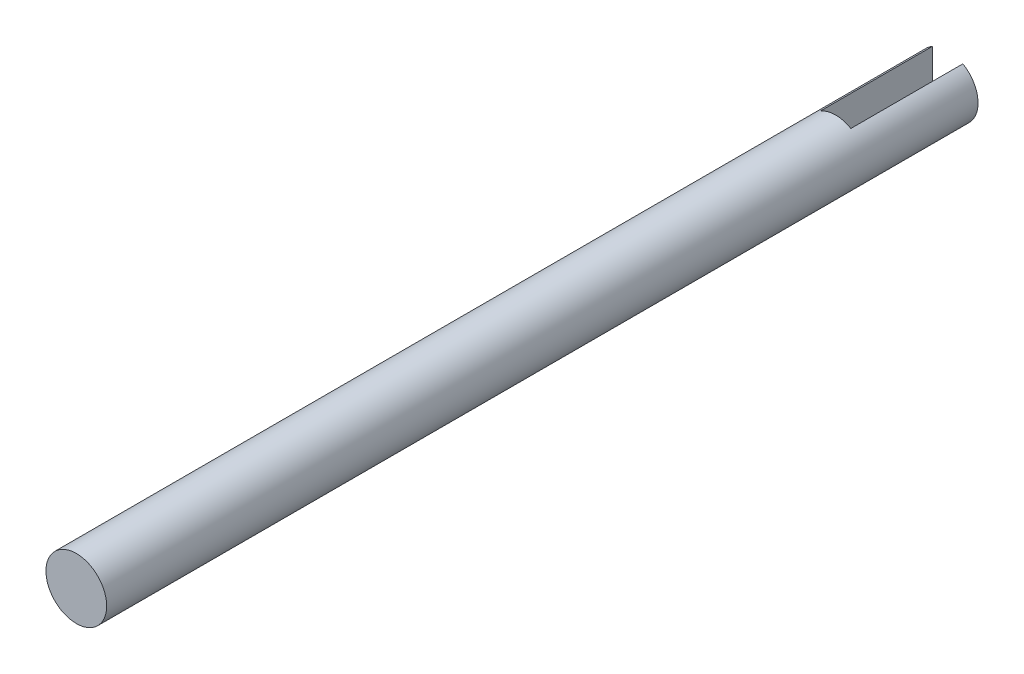
ISO-10303-21;
HEADER;
FILE_DESCRIPTION(('STEP AP214'),'2;1');
FILE_NAME('part.step','',(''),(''),'','','');
FILE_SCHEMA(('AUTOMOTIVE_DESIGN { 1 0 10303 214 1 1 1 1 }'));
ENDSEC;
DATA;
#1=APPLICATION_CONTEXT('core data for automotive mechanical design processes');
#2=APPLICATION_PROTOCOL_DEFINITION('international standard','automotive_design',2000,#1);
#3=PRODUCT_CONTEXT('',#1,'mechanical');
#4=PRODUCT('Part','Part','',(#3));
#5=PRODUCT_RELATED_PRODUCT_CATEGORY('part','',(#4));
#6=PRODUCT_DEFINITION_FORMATION('','',#4);
#7=PRODUCT_DEFINITION_CONTEXT('part definition',#1,'design');
#8=PRODUCT_DEFINITION('design','',#6,#7);
#9=PRODUCT_DEFINITION_SHAPE('','',#8);
#10=(LENGTH_UNIT() NAMED_UNIT(*) SI_UNIT(.MILLI.,.METRE.));
#11=(NAMED_UNIT(*) PLANE_ANGLE_UNIT() SI_UNIT($,.RADIAN.));
#12=(NAMED_UNIT(*) SI_UNIT($,.STERADIAN.) SOLID_ANGLE_UNIT());
#13=UNCERTAINTY_MEASURE_WITH_UNIT(LENGTH_MEASURE(1.E-05),#10,'distance_accuracy_value','');
#14=(GEOMETRIC_REPRESENTATION_CONTEXT(3) GLOBAL_UNCERTAINTY_ASSIGNED_CONTEXT((#13)) GLOBAL_UNIT_ASSIGNED_CONTEXT((#10,
#11,#12)) REPRESENTATION_CONTEXT('',''));
#15=CARTESIAN_POINT('',(0.,0.,0.));
#16=DIRECTION('',(0.,0.,1.));
#17=DIRECTION('',(1.,0.,0.));
#18=AXIS2_PLACEMENT_3D('',#15,#16,#17);
#19=CARTESIAN_POINT('',(0.,0.,107.5));
#20=DIRECTION('',(0.,0.,-1.));
#21=DIRECTION('',(-1.,0.,0.));
#22=AXIS2_PLACEMENT_3D('',#19,#20,#21);
#23=CYLINDRICAL_SURFACE('',#22,4.);
#24=CARTESIAN_POINT('',(0.,0.,107.5));
#25=DIRECTION('',(0.,0.,1.));
#26=DIRECTION('',(1.,0.,0.));
#27=AXIS2_PLACEMENT_3D('',#24,#25,#26);
#28=CIRCLE('',#27,4.);
#29=CARTESIAN_POINT('',(4.,0.,107.5));
#30=VERTEX_POINT('',#29);
#31=EDGE_CURVE('E11',#30,#30,#28,.T.);
#32=ORIENTED_EDGE('',*,*,#31,.F.);
#33=EDGE_LOOP('',(#32));
#34=FACE_BOUND('',#33,.T.);
#35=CARTESIAN_POINT('',(0.,0.,7.5));
#36=DIRECTION('',(0.,0.,1.));
#37=DIRECTION('',(1.,0.,0.));
#38=AXIS2_PLACEMENT_3D('',#35,#36,#37);
#39=CIRCLE('',#38,4.);
#40=CARTESIAN_POINT('',(2.,3.46410161513775,7.5));
#41=VERTEX_POINT('',#40);
#42=CARTESIAN_POINT('',(-2.,3.46410161513775,7.5));
#43=VERTEX_POINT('',#42);
#44=EDGE_CURVE('E46',#41,#43,#39,.T.);
#45=ORIENTED_EDGE('',*,*,#44,.T.);
#46=DIRECTION('',(0.,0.,1.));
#47=VECTOR('',#46,1.);
#48=CARTESIAN_POINT('',(-2.,3.46410161513775,-7.25));
#49=LINE('',#48,#47);
#50=CARTESIAN_POINT('',(-2.,3.46410161513775,-7.25));
#51=VERTEX_POINT('',#50);
#52=EDGE_CURVE('E57',#51,#43,#49,.T.);
#53=ORIENTED_EDGE('',*,*,#52,.F.);
#54=CARTESIAN_POINT('',(0.,0.,-7.25));
#55=DIRECTION('',(0.,0.,1.));
#56=DIRECTION('',(1.,0.,0.));
#57=AXIS2_PLACEMENT_3D('',#54,#55,#56);
#58=CIRCLE('',#57,4.);
#59=CARTESIAN_POINT('',(-2.,-3.46410161513775,-7.25));
#60=VERTEX_POINT('',#59);
#61=EDGE_CURVE('E85',#51,#60,#58,.T.);
#62=ORIENTED_EDGE('',*,*,#61,.T.);
#63=DIRECTION('',(0.,0.,1.));
#64=VECTOR('',#63,1.);
#65=CARTESIAN_POINT('',(-2.,-3.46410161513775,-7.25));
#66=LINE('',#65,#64);
#67=CARTESIAN_POINT('',(-2.,-3.46410161513775,7.5));
#68=VERTEX_POINT('',#67);
#69=EDGE_CURVE('E82',#60,#68,#66,.T.);
#70=ORIENTED_EDGE('',*,*,#69,.T.);
#71=CARTESIAN_POINT('',(2.,-3.46410161513775,7.5));
#72=VERTEX_POINT('',#71);
#73=EDGE_CURVE('E65',#68,#72,#39,.T.);
#74=ORIENTED_EDGE('',*,*,#73,.T.);
#75=DIRECTION('',(0.,0.,1.));
#76=VECTOR('',#75,1.);
#77=CARTESIAN_POINT('',(2.,-3.46410161513775,-7.25));
#78=LINE('',#77,#76);
#79=CARTESIAN_POINT('',(2.,-3.46410161513775,-7.25));
#80=VERTEX_POINT('',#79);
#81=EDGE_CURVE('E98',#80,#72,#78,.T.);
#82=ORIENTED_EDGE('',*,*,#81,.F.);
#83=CARTESIAN_POINT('',(0.,0.,-7.25));
#84=DIRECTION('',(0.,0.,1.));
#85=DIRECTION('',(1.,0.,0.));
#86=AXIS2_PLACEMENT_3D('',#83,#84,#85);
#87=CIRCLE('',#86,4.);
#88=CARTESIAN_POINT('',(2.,3.46410161513775,-7.25));
#89=VERTEX_POINT('',#88);
#90=EDGE_CURVE('E107',#80,#89,#87,.T.);
#91=ORIENTED_EDGE('',*,*,#90,.T.);
#92=DIRECTION('',(0.,0.,1.));
#93=VECTOR('',#92,1.);
#94=CARTESIAN_POINT('',(2.,3.46410161513775,-7.25));
#95=LINE('',#94,#93);
#96=EDGE_CURVE('E99',#89,#41,#95,.T.);
#97=ORIENTED_EDGE('',*,*,#96,.T.);
#98=EDGE_LOOP('',(#45,#53,#62,#70,#74,#82,#91,#97));
#99=FACE_BOUND('',#98,.T.);
#100=ADVANCED_FACE('F43',(#34,#99),#23,.T.);
#101=CARTESIAN_POINT('',(0.,0.,107.5));
#102=DIRECTION('',(0.,0.,1.));
#103=DIRECTION('',(1.,0.,0.));
#104=AXIS2_PLACEMENT_3D('',#101,#102,#103);
#105=PLANE('',#104);
#106=ORIENTED_EDGE('',*,*,#31,.T.);
#107=EDGE_LOOP('',(#106));
#108=FACE_BOUND('',#107,.T.);
#109=ADVANCED_FACE('F125',(#108),#105,.T.);
#110=CARTESIAN_POINT('',(0.,0.,7.5));
#111=DIRECTION('',(0.,0.,1.));
#112=DIRECTION('',(1.,0.,0.));
#113=AXIS2_PLACEMENT_3D('',#110,#111,#112);
#114=PLANE('',#113);
#115=ORIENTED_EDGE('',*,*,#73,.F.);
#116=DIRECTION('',(0.,1.,0.));
#117=VECTOR('',#116,1.);
#118=CARTESIAN_POINT('',(-2.,-3.46410161513775,7.5));
#119=LINE('',#118,#117);
#120=EDGE_CURVE('E89',#68,#43,#119,.T.);
#121=ORIENTED_EDGE('',*,*,#120,.T.);
#122=ORIENTED_EDGE('',*,*,#44,.F.);
#123=DIRECTION('',(0.,-1.,0.));
#124=VECTOR('',#123,1.);
#125=CARTESIAN_POINT('',(2.,3.46410161513775,7.5));
#126=LINE('',#125,#124);
#127=EDGE_CURVE('E93',#41,#72,#126,.T.);
#128=ORIENTED_EDGE('',*,*,#127,.T.);
#129=EDGE_LOOP('',(#115,#121,#122,#128));
#130=FACE_BOUND('',#129,.T.);
#131=ADVANCED_FACE('F96',(#130),#114,.F.);
#132=CARTESIAN_POINT('',(2.,3.46410161513775,-7.25));
#133=DIRECTION('',(-1.,0.,0.));
#134=DIRECTION('',(0.,0.,1.));
#135=AXIS2_PLACEMENT_3D('',#132,#133,#134);
#136=PLANE('',#135);
#137=ORIENTED_EDGE('',*,*,#127,.F.);
#138=ORIENTED_EDGE('',*,*,#96,.F.);
#139=DIRECTION('',(0.,-1.,0.));
#140=VECTOR('',#139,1.);
#141=CARTESIAN_POINT('',(2.,3.46410161513775,-7.25));
#142=LINE('',#141,#140);
#143=EDGE_CURVE('E103',#89,#80,#142,.T.);
#144=ORIENTED_EDGE('',*,*,#143,.T.);
#145=ORIENTED_EDGE('',*,*,#81,.T.);
#146=EDGE_LOOP('',(#137,#138,#144,#145));
#147=FACE_BOUND('',#146,.T.);
#148=ADVANCED_FACE('F138',(#147),#136,.T.);
#149=CARTESIAN_POINT('',(0.,0.,-7.25));
#150=DIRECTION('',(0.,0.,1.));
#151=DIRECTION('',(1.,0.,0.));
#152=AXIS2_PLACEMENT_3D('',#149,#150,#151);
#153=PLANE('',#152);
#154=ORIENTED_EDGE('',*,*,#90,.F.);
#155=ORIENTED_EDGE('',*,*,#143,.F.);
#156=EDGE_LOOP('',(#154,#155));
#157=FACE_BOUND('',#156,.T.);
#158=ADVANCED_FACE('F121',(#157),#153,.F.);
#159=CARTESIAN_POINT('',(-2.,-3.46410161513775,-7.25));
#160=DIRECTION('',(1.,0.,0.));
#161=DIRECTION('',(0.,0.,-1.));
#162=AXIS2_PLACEMENT_3D('',#159,#160,#161);
#163=PLANE('',#162);
#164=ORIENTED_EDGE('',*,*,#120,.F.);
#165=ORIENTED_EDGE('',*,*,#69,.F.);
#166=DIRECTION('',(0.,1.,0.));
#167=VECTOR('',#166,1.);
#168=CARTESIAN_POINT('',(-2.,-3.46410161513775,-7.25));
#169=LINE('',#168,#167);
#170=EDGE_CURVE('E87',#60,#51,#169,.T.);
#171=ORIENTED_EDGE('',*,*,#170,.T.);
#172=ORIENTED_EDGE('',*,*,#52,.T.);
#173=EDGE_LOOP('',(#164,#165,#171,#172));
#174=FACE_BOUND('',#173,.T.);
#175=ADVANCED_FACE('F90',(#174),#163,.T.);
#176=CARTESIAN_POINT('',(0.,0.,-7.25));
#177=DIRECTION('',(0.,0.,1.));
#178=DIRECTION('',(1.,0.,0.));
#179=AXIS2_PLACEMENT_3D('',#176,#177,#178);
#180=PLANE('',#179);
#181=ORIENTED_EDGE('',*,*,#61,.F.);
#182=ORIENTED_EDGE('',*,*,#170,.F.);
#183=EDGE_LOOP('',(#181,#182));
#184=FACE_BOUND('',#183,.T.);
#185=ADVANCED_FACE('F114',(#184),#180,.F.);
#186=CLOSED_SHELL('',(#100,#109,#131,#148,#158,#175,#185));
#187=MANIFOLD_SOLID_BREP('B2',#186);
#188=ADVANCED_BREP_SHAPE_REPRESENTATION('',(#18,#187),#14);
#189=SHAPE_DEFINITION_REPRESENTATION(#9,#188);
ENDSEC;
END-ISO-10303-21;
